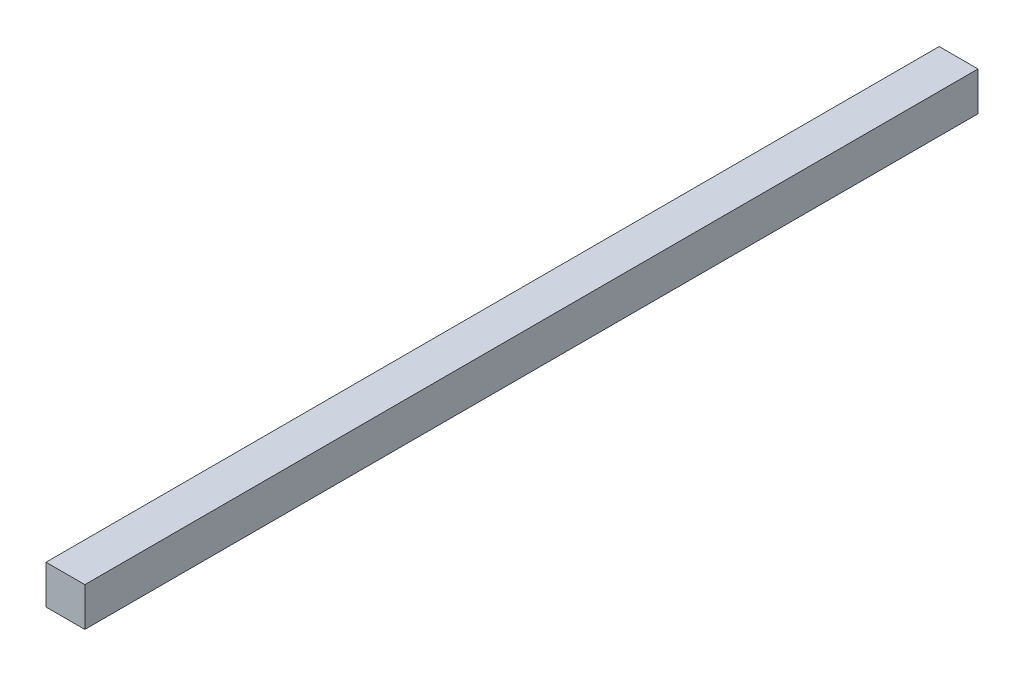
ISO-10303-21;
HEADER;
FILE_DESCRIPTION(('STEP AP214'),'2;1');
FILE_NAME('part.step','',(''),(''),'','','');
FILE_SCHEMA(('AUTOMOTIVE_DESIGN { 1 0 10303 214 1 1 1 1 }'));
ENDSEC;
DATA;
#1=APPLICATION_CONTEXT('core data for automotive mechanical design processes');
#2=APPLICATION_PROTOCOL_DEFINITION('international standard','automotive_design',2000,#1);
#3=PRODUCT_CONTEXT('',#1,'mechanical');
#4=PRODUCT('Part','Part','',(#3));
#5=PRODUCT_RELATED_PRODUCT_CATEGORY('part','',(#4));
#6=PRODUCT_DEFINITION_FORMATION('','',#4);
#7=PRODUCT_DEFINITION_CONTEXT('part definition',#1,'design');
#8=PRODUCT_DEFINITION('design','',#6,#7);
#9=PRODUCT_DEFINITION_SHAPE('','',#8);
#10=(LENGTH_UNIT() NAMED_UNIT(*) SI_UNIT(.MILLI.,.METRE.));
#11=(NAMED_UNIT(*) PLANE_ANGLE_UNIT() SI_UNIT($,.RADIAN.));
#12=(NAMED_UNIT(*) SI_UNIT($,.STERADIAN.) SOLID_ANGLE_UNIT());
#13=UNCERTAINTY_MEASURE_WITH_UNIT(LENGTH_MEASURE(1.E-05),#10,'distance_accuracy_value','');
#14=(GEOMETRIC_REPRESENTATION_CONTEXT(3) GLOBAL_UNCERTAINTY_ASSIGNED_CONTEXT((#13)) GLOBAL_UNIT_ASSIGNED_CONTEXT((#10,
#11,#12)) REPRESENTATION_CONTEXT('',''));
#15=CARTESIAN_POINT('',(0.,0.,0.));
#16=DIRECTION('',(0.,0.,1.));
#17=DIRECTION('',(1.,0.,0.));
#18=AXIS2_PLACEMENT_3D('',#15,#16,#17);
#19=CARTESIAN_POINT('',(0.,0.,58.42));
#20=DIRECTION('',(-1.,0.,0.));
#21=DIRECTION('',(0.,-1.,0.));
#22=AXIS2_PLACEMENT_3D('',#19,#20,#21);
#23=PLANE('',#22);
#24=DIRECTION('',(0.,1.,0.));
#25=VECTOR('',#24,1.);
#26=CARTESIAN_POINT('',(0.,0.,0.));
#27=LINE('',#26,#25);
#28=CARTESIAN_POINT('',(0.,0.,0.));
#29=VERTEX_POINT('',#28);
#30=CARTESIAN_POINT('',(0.,2.54,0.));
#31=VERTEX_POINT('',#30);
#32=EDGE_CURVE('E97',#29,#31,#27,.T.);
#33=ORIENTED_EDGE('',*,*,#32,.T.);
#34=DIRECTION('',(0.,0.,-1.));
#35=VECTOR('',#34,1.);
#36=CARTESIAN_POINT('',(0.,2.54,58.42));
#37=LINE('',#36,#35);
#38=CARTESIAN_POINT('',(0.,2.54,58.42));
#39=VERTEX_POINT('',#38);
#40=EDGE_CURVE('E11',#39,#31,#37,.T.);
#41=ORIENTED_EDGE('',*,*,#40,.F.);
#42=DIRECTION('',(0.,1.,0.));
#43=VECTOR('',#42,1.);
#44=CARTESIAN_POINT('',(0.,0.,58.42));
#45=LINE('',#44,#43);
#46=CARTESIAN_POINT('',(0.,0.,58.42));
#47=VERTEX_POINT('',#46);
#48=EDGE_CURVE('E85',#47,#39,#45,.T.);
#49=ORIENTED_EDGE('',*,*,#48,.F.);
#50=DIRECTION('',(0.,0.,-1.));
#51=VECTOR('',#50,1.);
#52=CARTESIAN_POINT('',(0.,0.,58.42));
#53=LINE('',#52,#51);
#54=EDGE_CURVE('E93',#47,#29,#53,.T.);
#55=ORIENTED_EDGE('',*,*,#54,.T.);
#56=EDGE_LOOP('',(#33,#41,#49,#55));
#57=FACE_BOUND('',#56,.T.);
#58=ADVANCED_FACE('F34',(#57),#23,.F.);
#59=CARTESIAN_POINT('',(0.,2.54,58.42));
#60=DIRECTION('',(0.,-1.,0.));
#61=DIRECTION('',(1.,0.,0.));
#62=AXIS2_PLACEMENT_3D('',#59,#60,#61);
#63=PLANE('',#62);
#64=DIRECTION('',(-1.,0.,0.));
#65=VECTOR('',#64,1.);
#66=CARTESIAN_POINT('',(0.,2.54,0.));
#67=LINE('',#66,#65);
#68=CARTESIAN_POINT('',(-2.54,2.54,0.));
#69=VERTEX_POINT('',#68);
#70=EDGE_CURVE('E89',#31,#69,#67,.T.);
#71=ORIENTED_EDGE('',*,*,#70,.T.);
#72=DIRECTION('',(0.,0.,-1.));
#73=VECTOR('',#72,1.);
#74=CARTESIAN_POINT('',(-2.54,2.54,58.42));
#75=LINE('',#74,#73);
#76=CARTESIAN_POINT('',(-2.54,2.54,58.42));
#77=VERTEX_POINT('',#76);
#78=EDGE_CURVE('E42',#77,#69,#75,.T.);
#79=ORIENTED_EDGE('',*,*,#78,.F.);
#80=DIRECTION('',(-1.,0.,0.));
#81=VECTOR('',#80,1.);
#82=CARTESIAN_POINT('',(0.,2.54,58.42));
#83=LINE('',#82,#81);
#84=EDGE_CURVE('E80',#39,#77,#83,.T.);
#85=ORIENTED_EDGE('',*,*,#84,.F.);
#86=ORIENTED_EDGE('',*,*,#40,.T.);
#87=EDGE_LOOP('',(#71,#79,#85,#86));
#88=FACE_BOUND('',#87,.T.);
#89=ADVANCED_FACE('F88',(#88),#63,.F.);
#90=CARTESIAN_POINT('',(-2.54,0.,58.42));
#91=DIRECTION('',(1.,0.,0.));
#92=DIRECTION('',(0.,0.,-1.));
#93=AXIS2_PLACEMENT_3D('',#90,#91,#92);
#94=PLANE('',#93);
#95=DIRECTION('',(0.,-1.,0.));
#96=VECTOR('',#95,1.);
#97=CARTESIAN_POINT('',(-2.54,0.,0.));
#98=LINE('',#97,#96);
#99=CARTESIAN_POINT('',(-2.54,0.,0.));
#100=VERTEX_POINT('',#99);
#101=EDGE_CURVE('E67',#69,#100,#98,.T.);
#102=ORIENTED_EDGE('',*,*,#101,.T.);
#103=DIRECTION('',(0.,0.,-1.));
#104=VECTOR('',#103,1.);
#105=CARTESIAN_POINT('',(-2.54,0.,58.42));
#106=LINE('',#105,#104);
#107=CARTESIAN_POINT('',(-2.54,0.,58.42));
#108=VERTEX_POINT('',#107);
#109=EDGE_CURVE('E90',#108,#100,#106,.T.);
#110=ORIENTED_EDGE('',*,*,#109,.F.);
#111=DIRECTION('',(0.,-1.,0.));
#112=VECTOR('',#111,1.);
#113=CARTESIAN_POINT('',(-2.54,0.,58.42));
#114=LINE('',#113,#112);
#115=EDGE_CURVE('E83',#77,#108,#114,.T.);
#116=ORIENTED_EDGE('',*,*,#115,.F.);
#117=ORIENTED_EDGE('',*,*,#78,.T.);
#118=EDGE_LOOP('',(#102,#110,#116,#117));
#119=FACE_BOUND('',#118,.T.);
#120=ADVANCED_FACE('F91',(#119),#94,.F.);
#121=CARTESIAN_POINT('',(0.,0.,58.42));
#122=DIRECTION('',(0.,1.,0.));
#123=DIRECTION('',(0.,0.,1.));
#124=AXIS2_PLACEMENT_3D('',#121,#122,#123);
#125=PLANE('',#124);
#126=DIRECTION('',(1.,0.,0.));
#127=VECTOR('',#126,1.);
#128=CARTESIAN_POINT('',(0.,0.,0.));
#129=LINE('',#128,#127);
#130=EDGE_CURVE('E73',#100,#29,#129,.T.);
#131=ORIENTED_EDGE('',*,*,#130,.T.);
#132=ORIENTED_EDGE('',*,*,#54,.F.);
#133=DIRECTION('',(1.,0.,0.));
#134=VECTOR('',#133,1.);
#135=CARTESIAN_POINT('',(0.,0.,58.42));
#136=LINE('',#135,#134);
#137=EDGE_CURVE('E50',#108,#47,#136,.T.);
#138=ORIENTED_EDGE('',*,*,#137,.F.);
#139=ORIENTED_EDGE('',*,*,#109,.T.);
#140=EDGE_LOOP('',(#131,#132,#138,#139));
#141=FACE_BOUND('',#140,.T.);
#142=ADVANCED_FACE('F104',(#141),#125,.F.);
#143=CARTESIAN_POINT('',(0.,0.,58.42));
#144=DIRECTION('',(0.,0.,1.));
#145=DIRECTION('',(1.,0.,0.));
#146=AXIS2_PLACEMENT_3D('',#143,#144,#145);
#147=PLANE('',#146);
#148=ORIENTED_EDGE('',*,*,#48,.T.);
#149=ORIENTED_EDGE('',*,*,#84,.T.);
#150=ORIENTED_EDGE('',*,*,#115,.T.);
#151=ORIENTED_EDGE('',*,*,#137,.T.);
#152=EDGE_LOOP('',(#148,#149,#150,#151));
#153=FACE_BOUND('',#152,.T.);
#154=ADVANCED_FACE('F81',(#153),#147,.T.);
#155=CARTESIAN_POINT('',(0.,0.,0.));
#156=DIRECTION('',(0.,0.,1.));
#157=DIRECTION('',(1.,0.,0.));
#158=AXIS2_PLACEMENT_3D('',#155,#156,#157);
#159=PLANE('',#158);
#160=ORIENTED_EDGE('',*,*,#32,.F.);
#161=ORIENTED_EDGE('',*,*,#130,.F.);
#162=ORIENTED_EDGE('',*,*,#101,.F.);
#163=ORIENTED_EDGE('',*,*,#70,.F.);
#164=EDGE_LOOP('',(#160,#161,#162,#163));
#165=FACE_BOUND('',#164,.T.);
#166=ADVANCED_FACE('F107',(#165),#159,.F.);
#167=CLOSED_SHELL('',(#58,#89,#120,#142,#154,#166));
#168=MANIFOLD_SOLID_BREP('B2',#167);
#169=ADVANCED_BREP_SHAPE_REPRESENTATION('',(#18,#168),#14);
#170=SHAPE_DEFINITION_REPRESENTATION(#9,#169);
ENDSEC;
END-ISO-10303-21;
